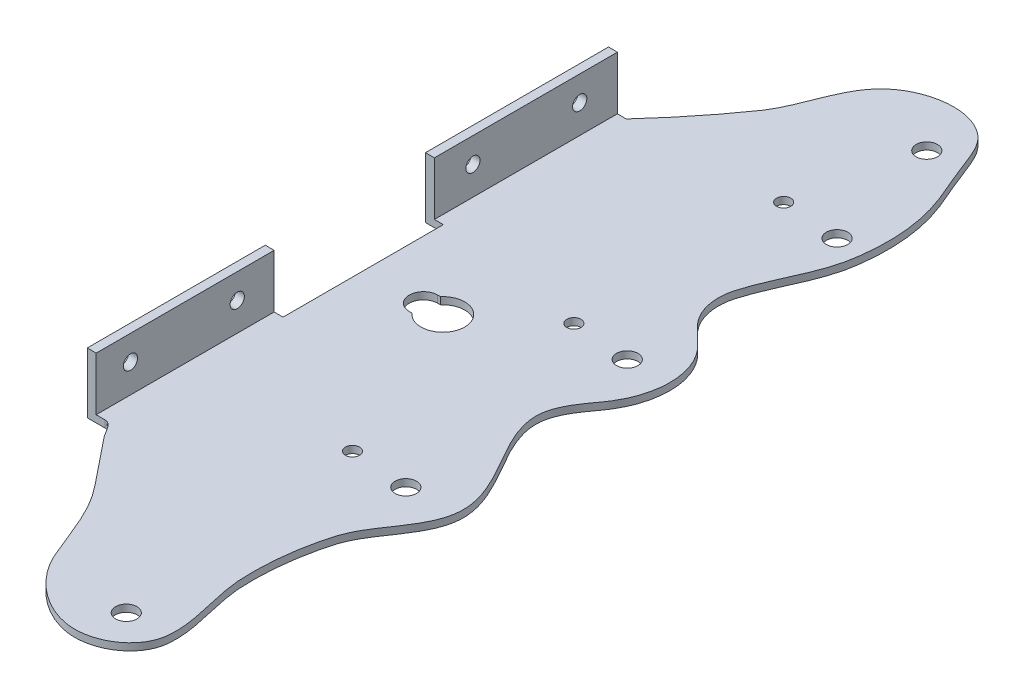
ISO-10303-21;
HEADER;
FILE_DESCRIPTION(('STEP AP214'),'2;1');
FILE_NAME('part.step','',(''),(''),'','','');
FILE_SCHEMA(('AUTOMOTIVE_DESIGN { 1 0 10303 214 1 1 1 1 }'));
ENDSEC;
DATA;
#1=APPLICATION_CONTEXT('core data for automotive mechanical design processes');
#2=APPLICATION_PROTOCOL_DEFINITION('international standard','automotive_design',2000,#1);
#3=PRODUCT_CONTEXT('',#1,'mechanical');
#4=PRODUCT('Part','Part','',(#3));
#5=PRODUCT_RELATED_PRODUCT_CATEGORY('part','',(#4));
#6=PRODUCT_DEFINITION_FORMATION('','',#4);
#7=PRODUCT_DEFINITION_CONTEXT('part definition',#1,'design');
#8=PRODUCT_DEFINITION('design','',#6,#7);
#9=PRODUCT_DEFINITION_SHAPE('','',#8);
#10=(LENGTH_UNIT() NAMED_UNIT(*) SI_UNIT(.MILLI.,.METRE.));
#11=(NAMED_UNIT(*) PLANE_ANGLE_UNIT() SI_UNIT($,.RADIAN.));
#12=(NAMED_UNIT(*) SI_UNIT($,.STERADIAN.) SOLID_ANGLE_UNIT());
#13=UNCERTAINTY_MEASURE_WITH_UNIT(LENGTH_MEASURE(1.E-05),#10,'distance_accuracy_value','');
#14=(GEOMETRIC_REPRESENTATION_CONTEXT(3) GLOBAL_UNCERTAINTY_ASSIGNED_CONTEXT((#13)) GLOBAL_UNIT_ASSIGNED_CONTEXT((#10,
#11,#12)) REPRESENTATION_CONTEXT('',''));
#15=CARTESIAN_POINT('',(0.,0.,0.));
#16=DIRECTION('',(0.,0.,1.));
#17=DIRECTION('',(1.,0.,0.));
#18=AXIS2_PLACEMENT_3D('',#15,#16,#17);
#19=CARTESIAN_POINT('',(255.661074439726,2.,1028.80563383513));
#20=DIRECTION('',(0.,-1.,0.));
#21=DIRECTION('',(0.,0.,1.));
#22=AXIS2_PLACEMENT_3D('',#19,#20,#21);
#23=PLANE('',#22);
#24=CARTESIAN_POINT('',(454.197507278282,2.,1130.7574095105));
#25=DIRECTION('',(0.,-1.,0.));
#26=DIRECTION('',(0.,0.,-1.));
#27=AXIS2_PLACEMENT_3D('',#24,#25,#26);
#28=CIRCLE('',#27,2.99999999999999);
#29=CARTESIAN_POINT('',(454.197507278282,2.,1127.7574095105));
#30=VERTEX_POINT('',#29);
#31=EDGE_CURVE('E437',#30,#30,#28,.T.);
#32=ORIENTED_EDGE('',*,*,#31,.T.);
#33=EDGE_LOOP('',(#32));
#34=FACE_BOUND('',#33,.T.);
#35=CARTESIAN_POINT('',(462.939861939,2.,1164.71408522884));
#36=DIRECTION('',(0.,-1.,0.));
#37=DIRECTION('',(0.,0.,-1.));
#38=AXIS2_PLACEMENT_3D('',#35,#36,#37);
#39=CIRCLE('',#38,2.99999999999999);
#40=CARTESIAN_POINT('',(462.939861939,2.,1161.71408522884));
#41=VERTEX_POINT('',#40);
#42=EDGE_CURVE('E433',#41,#41,#39,.T.);
#43=ORIENTED_EDGE('',*,*,#42,.T.);
#44=EDGE_LOOP('',(#43));
#45=FACE_BOUND('',#44,.T.);
#46=CARTESIAN_POINT('',(462.939861939,2.,1223.64910089011));
#47=DIRECTION('',(0.,-1.,0.));
#48=DIRECTION('',(0.,0.,-1.));
#49=AXIS2_PLACEMENT_3D('',#46,#47,#48);
#50=CIRCLE('',#49,2.99999999999999);
#51=CARTESIAN_POINT('',(462.939861939,2.,1220.64910089011));
#52=VERTEX_POINT('',#51);
#53=EDGE_CURVE('E431',#52,#52,#50,.T.);
#54=ORIENTED_EDGE('',*,*,#53,.T.);
#55=EDGE_LOOP('',(#54));
#56=FACE_BOUND('',#55,.T.);
#57=CARTESIAN_POINT('',(462.939861939,2.,1285.84435146029));
#58=DIRECTION('',(0.,-1.,0.));
#59=DIRECTION('',(0.,0.,-1.));
#60=AXIS2_PLACEMENT_3D('',#57,#58,#59);
#61=CIRCLE('',#60,2.99999999999999);
#62=CARTESIAN_POINT('',(462.939861939,2.,1282.84435146029));
#63=VERTEX_POINT('',#62);
#64=EDGE_CURVE('E434',#63,#63,#61,.T.);
#65=ORIENTED_EDGE('',*,*,#64,.T.);
#66=EDGE_LOOP('',(#65));
#67=FACE_BOUND('',#66,.T.);
#68=CARTESIAN_POINT('',(454.197507278282,2.,1355.62910089056));
#69=DIRECTION('',(0.,-1.,0.));
#70=DIRECTION('',(0.,0.,-1.));
#71=AXIS2_PLACEMENT_3D('',#68,#69,#70);
#72=CIRCLE('',#71,2.99999999999999);
#73=CARTESIAN_POINT('',(454.197507278282,2.,1352.62910089056));
#74=VERTEX_POINT('',#73);
#75=EDGE_CURVE('E440',#74,#74,#72,.T.);
#76=ORIENTED_EDGE('',*,*,#75,.T.);
#77=EDGE_LOOP('',(#76));
#78=FACE_BOUND('',#77,.T.);
#79=CARTESIAN_POINT('',(446.65971355284,2.,1222.36199710261));
#80=DIRECTION('',(0.,-1.,0.));
#81=DIRECTION('',(0.,0.,-1.));
#82=AXIS2_PLACEMENT_3D('',#79,#80,#81);
#83=CIRCLE('',#82,2.);
#84=CARTESIAN_POINT('',(446.65971355284,2.,1220.36199710261));
#85=VERTEX_POINT('',#84);
#86=EDGE_CURVE('E480',#85,#85,#83,.T.);
#87=ORIENTED_EDGE('',*,*,#86,.T.);
#88=EDGE_LOOP('',(#87));
#89=FACE_BOUND('',#88,.T.);
#90=CARTESIAN_POINT('',(446.65971355284,2.,1163.42698144134));
#91=DIRECTION('',(0.,-1.,0.));
#92=DIRECTION('',(0.,0.,-1.));
#93=AXIS2_PLACEMENT_3D('',#90,#91,#92);
#94=CIRCLE('',#93,2.);
#95=CARTESIAN_POINT('',(446.65971355284,2.,1161.42698144134));
#96=VERTEX_POINT('',#95);
#97=EDGE_CURVE('E185',#96,#96,#94,.T.);
#98=ORIENTED_EDGE('',*,*,#97,.T.);
#99=EDGE_LOOP('',(#98));
#100=FACE_BOUND('',#99,.T.);
#101=DIRECTION('',(-1.,0.,0.));
#102=VECTOR('',#101,1.);
#103=CARTESIAN_POINT('',(421.436838318646,2.,1242.58627070393));
#104=LINE('',#103,#102);
#105=CARTESIAN_POINT('',(421.436838318646,2.,1242.58627070393));
#106=VERTEX_POINT('',#105);
#107=CARTESIAN_POINT('',(420.648750920919,2.,1242.58627070393));
#108=VERTEX_POINT('',#107);
#109=EDGE_CURVE('E171',#106,#108,#104,.T.);
#110=ORIENTED_EDGE('',*,*,#109,.T.);
#111=CARTESIAN_POINT('',(420.648750920919,2.,1238.58627070393));
#112=DIRECTION('',(0.,-1.,0.));
#113=DIRECTION('',(0.,0.,-1.));
#114=AXIS2_PLACEMENT_3D('',#111,#112,#113);
#115=CIRCLE('',#114,4.);
#116=CARTESIAN_POINT('',(420.64875092092,2.,1234.58627070393));
#117=VERTEX_POINT('',#116);
#118=EDGE_CURVE('E187',#108,#117,#115,.T.);
#119=ORIENTED_EDGE('',*,*,#118,.T.);
#120=DIRECTION('',(1.,0.,0.));
#121=VECTOR('',#120,1.);
#122=CARTESIAN_POINT('',(420.648750920919,2.,1234.58627070393));
#123=LINE('',#122,#121);
#124=CARTESIAN_POINT('',(421.436838318646,2.,1234.58627070393));
#125=VERTEX_POINT('',#124);
#126=EDGE_CURVE('E198',#117,#125,#123,.T.);
#127=ORIENTED_EDGE('',*,*,#126,.T.);
#128=CARTESIAN_POINT('',(426.08968266473,2.,1238.58627070393));
#129=DIRECTION('',(0.,1.,0.));
#130=DIRECTION('',(0.,0.,1.));
#131=AXIS2_PLACEMENT_3D('',#128,#129,#130);
#132=CIRCLE('',#131,6.13587487721889);
#133=EDGE_CURVE('E184',#106,#125,#132,.T.);
#134=ORIENTED_EDGE('',*,*,#133,.F.);
#135=EDGE_LOOP('',(#110,#119,#127,#134));
#136=FACE_BOUND('',#135,.T.);
#137=DIRECTION('',(0.,0.,1.));
#138=VECTOR('',#137,1.);
#139=CARTESIAN_POINT('',(401.796086460194,2.,1216.68291310392));
#140=LINE('',#139,#138);
#141=CARTESIAN_POINT('',(401.796086460194,2.,1165.26432310716));
#142=VERTEX_POINT('',#141);
#143=CARTESIAN_POINT('',(401.796086460194,2.,1216.68291310392));
#144=VERTEX_POINT('',#143);
#145=EDGE_CURVE('E202',#142,#144,#140,.T.);
#146=ORIENTED_EDGE('',*,*,#145,.T.);
#147=DIRECTION('',(1.,0.,0.));
#148=VECTOR('',#147,1.);
#149=CARTESIAN_POINT('',(399.293679944663,2.,1216.68291310392));
#150=LINE('',#149,#148);
#151=CARTESIAN_POINT('',(404.298492975727,2.,1216.68291310392));
#152=VERTEX_POINT('',#151);
#153=EDGE_CURVE('E231',#144,#152,#150,.T.);
#154=ORIENTED_EDGE('',*,*,#153,.T.);
#155=DIRECTION('',(0.,0.,1.));
#156=VECTOR('',#155,1.);
#157=CARTESIAN_POINT('',(404.298492975727,2.,1165.26432310716));
#158=LINE('',#157,#156);
#159=CARTESIAN_POINT('',(404.298492975727,2.,1261.68291310392));
#160=VERTEX_POINT('',#159);
#161=EDGE_CURVE('E287',#152,#160,#158,.T.);
#162=ORIENTED_EDGE('',*,*,#161,.T.);
#163=DIRECTION('',(1.,0.,0.));
#164=VECTOR('',#163,1.);
#165=CARTESIAN_POINT('',(399.293679944663,2.,1261.68291310392));
#166=LINE('',#165,#164);
#167=CARTESIAN_POINT('',(401.796086460194,2.,1261.68291310392));
#168=VERTEX_POINT('',#167);
#169=EDGE_CURVE('E274',#168,#160,#166,.T.);
#170=ORIENTED_EDGE('',*,*,#169,.F.);
#171=DIRECTION('',(0.,0.,1.));
#172=VECTOR('',#171,1.);
#173=CARTESIAN_POINT('',(401.796086460194,2.,1311.68291310392));
#174=LINE('',#173,#172);
#175=CARTESIAN_POINT('',(401.796086460194,2.,1311.68291310392));
#176=VERTEX_POINT('',#175);
#177=EDGE_CURVE('E244',#168,#176,#174,.T.);
#178=ORIENTED_EDGE('',*,*,#177,.T.);
#179=DIRECTION('',(1.,0.,0.));
#180=VECTOR('',#179,1.);
#181=CARTESIAN_POINT('',(399.293679944663,2.,1311.68291310392));
#182=LINE('',#181,#180);
#183=CARTESIAN_POINT('',(404.298492975727,2.,1311.68291310392));
#184=VERTEX_POINT('',#183);
#185=EDGE_CURVE('E270',#176,#184,#182,.T.);
#186=ORIENTED_EDGE('',*,*,#185,.T.);
#187=CARTESIAN_POINT('',(404.298492975727,2.,1311.68291310392));
#188=CARTESIAN_POINT('',(406.295600934266,2.,1311.73670595974));
#189=CARTESIAN_POINT('',(407.085011737817,2.,1314.44879871172));
#190=CARTESIAN_POINT('',(409.575192944788,2.,1317.5434505828));
#191=CARTESIAN_POINT('',(410.820283548274,2.,1319.09077651834));
#192=CARTESIAN_POINT('',(414.555555358731,2.,1323.73275432495));
#193=CARTESIAN_POINT('',(417.064874752061,2.,1326.79999933437));
#194=CARTESIAN_POINT('',(424.513235646728,2.,1336.3101324201));
#195=CARTESIAN_POINT('',(426.853193629925,2.,1344.04509664726));
#196=CARTESIAN_POINT('',(433.171429491688,2.,1358.70777750479));
#197=CARTESIAN_POINT('',(440.246388319815,2.,1365.15509536691));
#198=CARTESIAN_POINT('',(456.088524035443,2.,1368.09341802965));
#199=CARTESIAN_POINT('',(464.999916661629,2.,1362.93260796018));
#200=CARTESIAN_POINT('',(466.165817384064,2.,1346.91506331004));
#201=CARTESIAN_POINT('',(462.473581677715,2.,1339.19033657056));
#202=CARTESIAN_POINT('',(461.762695776429,2.,1323.25818510204));
#203=CARTESIAN_POINT('',(462.721630003401,2.,1315.29199422972));
#204=CARTESIAN_POINT('',(467.160419551933,2.,1300.06745588101));
#205=CARTESIAN_POINT('',(474.17625309899,2.,1294.50552442475));
#206=CARTESIAN_POINT('',(477.954929379964,2.,1278.72367697068));
#207=CARTESIAN_POINT('',(472.734514964729,2.,1270.97658607166));
#208=CARTESIAN_POINT('',(465.105690644388,2.,1257.2724683784));
#209=CARTESIAN_POINT('',(463.326944585366,2.,1252.4305742544));
#210=CARTESIAN_POINT('',(464.721292468545,2.,1244.26561835925));
#211=CARTESIAN_POINT('',(467.324164939411,2.,1240.80520416999));
#212=CARTESIAN_POINT('',(474.859619179385,2.,1230.45901557285));
#213=CARTESIAN_POINT('',(476.348995327918,2.,1220.80819832412));
#214=CARTESIAN_POINT('',(469.715777811257,2.,1209.81143323898));
#215=CARTESIAN_POINT('',(465.878031568866,2.,1207.57126665351));
#216=CARTESIAN_POINT('',(460.805018265854,2.,1200.61149649099));
#217=CARTESIAN_POINT('',(460.133507775431,2.,1195.93397954467));
#218=CARTESIAN_POINT('',(463.620047448152,2.,1183.54943758628));
#219=CARTESIAN_POINT('',(468.654313929908,2.,1176.213189786));
#220=CARTESIAN_POINT('',(471.504835360422,2.,1159.35233282218));
#221=CARTESIAN_POINT('',(471.10454470028,2.,1150.51786853807));
#222=CARTESIAN_POINT('',(466.884735434399,2.,1138.41732568748));
#223=CARTESIAN_POINT('',(465.012012783357,2.,1134.57344816104));
#224=CARTESIAN_POINT('',(461.842122723715,2.,1126.61511106856));
#225=CARTESIAN_POINT('',(460.633411015589,2.,1122.17984978088));
#226=CARTESIAN_POINT('',(450.489854867589,2.,1114.24592382287));
#227=CARTESIAN_POINT('',(439.660076739881,2.,1115.94459527402));
#228=CARTESIAN_POINT('',(427.144129501304,2.,1127.18007234506));
#229=CARTESIAN_POINT('',(426.027987251622,2.,1136.67754395337));
#230=CARTESIAN_POINT('',(421.436838304636,2.,1143.83803006286));
#231=B_SPLINE_CURVE_WITH_KNOTS('',3,(#187,#188,#189,#190,#191,#192,#193,#194,#195,#196,#197,
#198,#199,#200,#201,#202,#203,#204,#205,#206,#207,#208,#209,#210,#211,#212,#213,#214,#215,#216,
#217,#218,#219,#220,#221,#222,#223,#224,#225,#226,#227,#228,#229,#230),.UNSPECIFIED.,.F.,.F.,(4,
2,2,2,2,2,2,2,2,2,2,2,2,2,2,2,2,2,2,2,2,4),(0.,0.0156249999999999,0.0312499999999998,
0.0625000000000006,0.125000000000001,0.187500000000001,0.250000000000002,0.312500000000002,
0.375000000000002,0.437500000000003,0.500000000000003,0.531250000000003,0.562500000000003,
0.625000000000004,0.656250000000003,0.687500000000003,0.750000000000001,0.8125,
0.843750000000001,0.875000000000001,0.9375,1.),.UNSPECIFIED.);
#232=CARTESIAN_POINT('',(421.436838304636,2.,1143.83803006286));
#233=VERTEX_POINT('',#232);
#234=EDGE_CURVE('E291',#184,#233,#231,.T.);
#235=ORIENTED_EDGE('',*,*,#234,.T.);
#236=CARTESIAN_POINT('',(255.661074439726,2.,1028.80563383513));
#237=DIRECTION('',(0.,-1.,0.));
#238=DIRECTION('',(0.,0.,1.));
#239=AXIS2_PLACEMENT_3D('',#236,#237,#238);
#240=CIRCLE('',#239,201.777243679479);
#241=CARTESIAN_POINT('',(404.298492975727,2.,1165.26432310716));
#242=VERTEX_POINT('',#241);
#243=EDGE_CURVE('E284',#233,#242,#240,.T.);
#244=ORIENTED_EDGE('',*,*,#243,.T.);
#245=DIRECTION('',(1.,0.,0.));
#246=VECTOR('',#245,1.);
#247=CARTESIAN_POINT('',(399.293679944663,2.,1165.26432310716));
#248=LINE('',#247,#246);
#249=EDGE_CURVE('E235',#142,#242,#248,.T.);
#250=ORIENTED_EDGE('',*,*,#249,.F.);
#251=EDGE_LOOP('',(#146,#154,#162,#170,#178,#186,#235,#244,#250));
#252=FACE_BOUND('',#251,.T.);
#253=CARTESIAN_POINT('',(446.65971355284,2.,1284.55724767279));
#254=DIRECTION('',(0.,-1.,0.));
#255=DIRECTION('',(0.,0.,-1.));
#256=AXIS2_PLACEMENT_3D('',#253,#254,#255);
#257=CIRCLE('',#256,2.);
#258=CARTESIAN_POINT('',(446.65971355284,2.,1282.55724767279));
#259=VERTEX_POINT('',#258);
#260=EDGE_CURVE('E190',#259,#259,#257,.T.);
#261=ORIENTED_EDGE('',*,*,#260,.T.);
#262=EDGE_LOOP('',(#261));
#263=FACE_BOUND('',#262,.T.);
#264=ADVANCED_FACE('F43',(#34,#45,#56,#67,#78,#89,#100,#136,#252,#263),#23,.F.);
#265=CARTESIAN_POINT('',(255.661074439726,0.,1028.80563383513));
#266=DIRECTION('',(0.,-1.,0.));
#267=DIRECTION('',(0.,0.,1.));
#268=AXIS2_PLACEMENT_3D('',#265,#266,#267);
#269=PLANE('',#268);
#270=CARTESIAN_POINT('',(446.65971355284,0.,1222.36199710261));
#271=DIRECTION('',(0.,1.,0.));
#272=DIRECTION('',(0.,0.,1.));
#273=AXIS2_PLACEMENT_3D('',#270,#271,#272);
#274=CIRCLE('',#273,2.);
#275=CARTESIAN_POINT('',(446.65971355284,0.,1224.36199710261));
#276=VERTEX_POINT('',#275);
#277=EDGE_CURVE('E445',#276,#276,#274,.T.);
#278=ORIENTED_EDGE('',*,*,#277,.T.);
#279=EDGE_LOOP('',(#278));
#280=FACE_BOUND('',#279,.T.);
#281=CARTESIAN_POINT('',(446.65971355284,0.,1163.42698144134));
#282=DIRECTION('',(0.,1.,0.));
#283=DIRECTION('',(0.,0.,1.));
#284=AXIS2_PLACEMENT_3D('',#281,#282,#283);
#285=CIRCLE('',#284,2.);
#286=CARTESIAN_POINT('',(446.65971355284,0.,1165.42698144134));
#287=VERTEX_POINT('',#286);
#288=EDGE_CURVE('E452',#287,#287,#285,.T.);
#289=ORIENTED_EDGE('',*,*,#288,.T.);
#290=EDGE_LOOP('',(#289));
#291=FACE_BOUND('',#290,.T.);
#292=CARTESIAN_POINT('',(454.197507278282,0.,1130.7574095105));
#293=DIRECTION('',(0.,1.,0.));
#294=DIRECTION('',(0.,0.,1.));
#295=AXIS2_PLACEMENT_3D('',#292,#293,#294);
#296=CIRCLE('',#295,2.99999999999999);
#297=CARTESIAN_POINT('',(454.197507278282,0.,1133.7574095105));
#298=VERTEX_POINT('',#297);
#299=EDGE_CURVE('E47',#298,#298,#296,.T.);
#300=ORIENTED_EDGE('',*,*,#299,.T.);
#301=EDGE_LOOP('',(#300));
#302=FACE_BOUND('',#301,.T.);
#303=CARTESIAN_POINT('',(462.939861939,0.,1164.71408522884));
#304=DIRECTION('',(0.,1.,0.));
#305=DIRECTION('',(0.,0.,1.));
#306=AXIS2_PLACEMENT_3D('',#303,#304,#305);
#307=CIRCLE('',#306,2.99999999999999);
#308=CARTESIAN_POINT('',(462.939861939,0.,1167.71408522884));
#309=VERTEX_POINT('',#308);
#310=EDGE_CURVE('E511',#309,#309,#307,.T.);
#311=ORIENTED_EDGE('',*,*,#310,.T.);
#312=EDGE_LOOP('',(#311));
#313=FACE_BOUND('',#312,.T.);
#314=CARTESIAN_POINT('',(462.939861939,0.,1223.64910089011));
#315=DIRECTION('',(0.,1.,0.));
#316=DIRECTION('',(0.,0.,1.));
#317=AXIS2_PLACEMENT_3D('',#314,#315,#316);
#318=CIRCLE('',#317,2.99999999999999);
#319=CARTESIAN_POINT('',(462.939861939,0.,1226.64910089011));
#320=VERTEX_POINT('',#319);
#321=EDGE_CURVE('E428',#320,#320,#318,.T.);
#322=ORIENTED_EDGE('',*,*,#321,.T.);
#323=EDGE_LOOP('',(#322));
#324=FACE_BOUND('',#323,.T.);
#325=CARTESIAN_POINT('',(462.939861939,0.,1285.84435146029));
#326=DIRECTION('',(0.,1.,0.));
#327=DIRECTION('',(0.,0.,1.));
#328=AXIS2_PLACEMENT_3D('',#325,#326,#327);
#329=CIRCLE('',#328,2.99999999999999);
#330=CARTESIAN_POINT('',(462.939861939,0.,1288.84435146029));
#331=VERTEX_POINT('',#330);
#332=EDGE_CURVE('E508',#331,#331,#329,.T.);
#333=ORIENTED_EDGE('',*,*,#332,.T.);
#334=EDGE_LOOP('',(#333));
#335=FACE_BOUND('',#334,.T.);
#336=CARTESIAN_POINT('',(454.197507278282,0.,1355.62910089056));
#337=DIRECTION('',(0.,1.,0.));
#338=DIRECTION('',(0.,0.,1.));
#339=AXIS2_PLACEMENT_3D('',#336,#337,#338);
#340=CIRCLE('',#339,2.99999999999999);
#341=CARTESIAN_POINT('',(454.197507278282,0.,1358.62910089056));
#342=VERTEX_POINT('',#341);
#343=EDGE_CURVE('E455',#342,#342,#340,.T.);
#344=ORIENTED_EDGE('',*,*,#343,.T.);
#345=EDGE_LOOP('',(#344));
#346=FACE_BOUND('',#345,.T.);
#347=CARTESIAN_POINT('',(446.65971355284,0.,1284.55724767279));
#348=DIRECTION('',(0.,1.,0.));
#349=DIRECTION('',(0.,0.,1.));
#350=AXIS2_PLACEMENT_3D('',#347,#348,#349);
#351=CIRCLE('',#350,2.);
#352=CARTESIAN_POINT('',(446.65971355284,0.,1286.55724767279));
#353=VERTEX_POINT('',#352);
#354=EDGE_CURVE('E449',#353,#353,#351,.T.);
#355=ORIENTED_EDGE('',*,*,#354,.T.);
#356=EDGE_LOOP('',(#355));
#357=FACE_BOUND('',#356,.T.);
#358=CARTESIAN_POINT('',(255.661074439726,0.,1028.80563383513));
#359=DIRECTION('',(0.,-1.,0.));
#360=DIRECTION('',(0.,0.,1.));
#361=AXIS2_PLACEMENT_3D('',#358,#359,#360);
#362=CIRCLE('',#361,201.777243679479);
#363=CARTESIAN_POINT('',(421.436838304636,0.,1143.83803006286));
#364=VERTEX_POINT('',#363);
#365=CARTESIAN_POINT('',(404.298492975727,0.,1165.26432310716));
#366=VERTEX_POINT('',#365);
#367=EDGE_CURVE('E283',#364,#366,#362,.T.);
#368=ORIENTED_EDGE('',*,*,#367,.F.);
#369=CARTESIAN_POINT('',(404.298492975727,0.,1311.68291310392));
#370=CARTESIAN_POINT('',(406.295600934266,0.,1311.73670595974));
#371=CARTESIAN_POINT('',(407.085011737817,0.,1314.44879871172));
#372=CARTESIAN_POINT('',(409.575192944788,0.,1317.5434505828));
#373=CARTESIAN_POINT('',(410.820283548274,0.,1319.09077651834));
#374=CARTESIAN_POINT('',(414.555555358731,0.,1323.73275432495));
#375=CARTESIAN_POINT('',(417.064874752061,0.,1326.79999933437));
#376=CARTESIAN_POINT('',(424.513235646728,0.,1336.3101324201));
#377=CARTESIAN_POINT('',(426.853193629925,0.,1344.04509664726));
#378=CARTESIAN_POINT('',(433.171429491688,0.,1358.70777750479));
#379=CARTESIAN_POINT('',(440.246388319815,0.,1365.15509536691));
#380=CARTESIAN_POINT('',(456.088524035443,0.,1368.09341802965));
#381=CARTESIAN_POINT('',(464.999916661629,0.,1362.93260796018));
#382=CARTESIAN_POINT('',(466.165817384064,0.,1346.91506331004));
#383=CARTESIAN_POINT('',(462.473581677715,0.,1339.19033657056));
#384=CARTESIAN_POINT('',(461.762695776429,0.,1323.25818510204));
#385=CARTESIAN_POINT('',(462.721630003401,0.,1315.29199422972));
#386=CARTESIAN_POINT('',(467.160419551933,0.,1300.06745588101));
#387=CARTESIAN_POINT('',(474.17625309899,0.,1294.50552442475));
#388=CARTESIAN_POINT('',(477.954929379964,0.,1278.72367697068));
#389=CARTESIAN_POINT('',(472.734514964729,0.,1270.97658607166));
#390=CARTESIAN_POINT('',(465.105690644388,0.,1257.2724683784));
#391=CARTESIAN_POINT('',(463.326944585366,0.,1252.4305742544));
#392=CARTESIAN_POINT('',(464.721292468545,0.,1244.26561835925));
#393=CARTESIAN_POINT('',(467.324164939411,0.,1240.80520416999));
#394=CARTESIAN_POINT('',(474.859619179385,0.,1230.45901557285));
#395=CARTESIAN_POINT('',(476.348995327918,0.,1220.80819832412));
#396=CARTESIAN_POINT('',(469.715777811257,0.,1209.81143323898));
#397=CARTESIAN_POINT('',(465.878031568866,0.,1207.57126665351));
#398=CARTESIAN_POINT('',(460.805018265854,0.,1200.61149649099));
#399=CARTESIAN_POINT('',(460.133507775431,0.,1195.93397954467));
#400=CARTESIAN_POINT('',(463.620047448152,0.,1183.54943758628));
#401=CARTESIAN_POINT('',(468.654313929908,0.,1176.213189786));
#402=CARTESIAN_POINT('',(471.504835360422,0.,1159.35233282218));
#403=CARTESIAN_POINT('',(471.10454470028,0.,1150.51786853807));
#404=CARTESIAN_POINT('',(466.884735434399,0.,1138.41732568748));
#405=CARTESIAN_POINT('',(465.012012783357,0.,1134.57344816104));
#406=CARTESIAN_POINT('',(461.842122723715,0.,1126.61511106856));
#407=CARTESIAN_POINT('',(460.633411015589,0.,1122.17984978088));
#408=CARTESIAN_POINT('',(450.489854867589,0.,1114.24592382287));
#409=CARTESIAN_POINT('',(439.660076739881,0.,1115.94459527402));
#410=CARTESIAN_POINT('',(427.144129501304,0.,1127.18007234506));
#411=CARTESIAN_POINT('',(426.027987251622,0.,1136.67754395337));
#412=CARTESIAN_POINT('',(421.436838304636,0.,1143.83803006286));
#413=B_SPLINE_CURVE_WITH_KNOTS('',3,(#369,#370,#371,#372,#373,#374,#375,#376,#377,#378,#379,
#380,#381,#382,#383,#384,#385,#386,#387,#388,#389,#390,#391,#392,#393,#394,#395,#396,#397,#398,
#399,#400,#401,#402,#403,#404,#405,#406,#407,#408,#409,#410,#411,#412),.UNSPECIFIED.,.F.,.F.,(4,
2,2,2,2,2,2,2,2,2,2,2,2,2,2,2,2,2,2,2,2,4),(0.,0.0156249999999999,0.0312499999999998,
0.0625000000000006,0.125000000000001,0.187500000000001,0.250000000000002,0.312500000000002,
0.375000000000002,0.437500000000003,0.500000000000003,0.531250000000003,0.562500000000003,
0.625000000000004,0.656250000000003,0.687500000000003,0.750000000000001,0.8125,
0.843750000000001,0.875000000000001,0.9375,1.),.UNSPECIFIED.);
#414=CARTESIAN_POINT('',(404.298492975727,0.,1311.68291310392));
#415=VERTEX_POINT('',#414);
#416=EDGE_CURVE('E288',#415,#364,#413,.T.);
#417=ORIENTED_EDGE('',*,*,#416,.F.);
#418=DIRECTION('',(1.,0.,0.));
#419=VECTOR('',#418,1.);
#420=CARTESIAN_POINT('',(399.293679944663,0.,1311.68291310392));
#421=LINE('',#420,#419);
#422=CARTESIAN_POINT('',(399.293679944663,0.,1311.68291310392));
#423=VERTEX_POINT('',#422);
#424=EDGE_CURVE('E280',#423,#415,#421,.T.);
#425=ORIENTED_EDGE('',*,*,#424,.F.);
#426=DIRECTION('',(0.,0.,-1.));
#427=VECTOR('',#426,1.);
#428=CARTESIAN_POINT('',(399.293679944663,0.,1261.68291310392));
#429=LINE('',#428,#427);
#430=CARTESIAN_POINT('',(399.293679944663,0.,1261.68291310392));
#431=VERTEX_POINT('',#430);
#432=EDGE_CURVE('E264',#423,#431,#429,.T.);
#433=ORIENTED_EDGE('',*,*,#432,.T.);
#434=DIRECTION('',(1.,0.,0.));
#435=VECTOR('',#434,1.);
#436=CARTESIAN_POINT('',(399.293679944663,0.,1261.68291310392));
#437=LINE('',#436,#435);
#438=CARTESIAN_POINT('',(404.298492975727,0.,1261.68291310392));
#439=VERTEX_POINT('',#438);
#440=EDGE_CURVE('E277',#431,#439,#437,.T.);
#441=ORIENTED_EDGE('',*,*,#440,.T.);
#442=DIRECTION('',(0.,0.,1.));
#443=VECTOR('',#442,1.);
#444=CARTESIAN_POINT('',(404.298492975727,0.,1165.26432310716));
#445=LINE('',#444,#443);
#446=CARTESIAN_POINT('',(404.298492975727,0.,1216.68291310392));
#447=VERTEX_POINT('',#446);
#448=EDGE_CURVE('E495',#447,#439,#445,.T.);
#449=ORIENTED_EDGE('',*,*,#448,.F.);
#450=DIRECTION('',(1.,0.,0.));
#451=VECTOR('',#450,1.);
#452=CARTESIAN_POINT('',(399.293679944663,0.,1216.68291310392));
#453=LINE('',#452,#451);
#454=CARTESIAN_POINT('',(399.293679944663,0.,1216.68291310392));
#455=VERTEX_POINT('',#454);
#456=EDGE_CURVE('E241',#455,#447,#453,.T.);
#457=ORIENTED_EDGE('',*,*,#456,.F.);
#458=DIRECTION('',(0.,0.,-1.));
#459=VECTOR('',#458,1.);
#460=CARTESIAN_POINT('',(399.293679944663,0.,1165.26432310716));
#461=LINE('',#460,#459);
#462=CARTESIAN_POINT('',(399.293679944663,0.,1165.26432310716));
#463=VERTEX_POINT('',#462);
#464=EDGE_CURVE('E225',#455,#463,#461,.T.);
#465=ORIENTED_EDGE('',*,*,#464,.T.);
#466=DIRECTION('',(1.,0.,0.));
#467=VECTOR('',#466,1.);
#468=CARTESIAN_POINT('',(399.293679944663,0.,1165.26432310716));
#469=LINE('',#468,#467);
#470=EDGE_CURVE('E238',#463,#366,#469,.T.);
#471=ORIENTED_EDGE('',*,*,#470,.T.);
#472=EDGE_LOOP('',(#368,#417,#425,#433,#441,#449,#457,#465,#471));
#473=FACE_BOUND('',#472,.T.);
#474=CARTESIAN_POINT('',(426.08968266473,0.,1238.58627070393));
#475=DIRECTION('',(0.,1.,0.));
#476=DIRECTION('',(0.,0.,1.));
#477=AXIS2_PLACEMENT_3D('',#474,#475,#476);
#478=CIRCLE('',#477,6.13587487721889);
#479=CARTESIAN_POINT('',(421.436838318646,0.,1242.58627070393));
#480=VERTEX_POINT('',#479);
#481=CARTESIAN_POINT('',(421.436838318646,0.,1234.58627070393));
#482=VERTEX_POINT('',#481);
#483=EDGE_CURVE('E179',#480,#482,#478,.T.);
#484=ORIENTED_EDGE('',*,*,#483,.T.);
#485=DIRECTION('',(1.,0.,0.));
#486=VECTOR('',#485,1.);
#487=CARTESIAN_POINT('',(420.648750920919,0.,1234.58627070393));
#488=LINE('',#487,#486);
#489=CARTESIAN_POINT('',(420.648750920919,0.,1234.58627070393));
#490=VERTEX_POINT('',#489);
#491=EDGE_CURVE('E181',#490,#482,#488,.T.);
#492=ORIENTED_EDGE('',*,*,#491,.F.);
#493=CARTESIAN_POINT('',(420.648750920919,0.,1238.58627070393));
#494=DIRECTION('',(0.,-1.,0.));
#495=DIRECTION('',(0.,0.,-1.));
#496=AXIS2_PLACEMENT_3D('',#493,#494,#495);
#497=CIRCLE('',#496,4.);
#498=CARTESIAN_POINT('',(420.648750920919,0.,1242.58627070393));
#499=VERTEX_POINT('',#498);
#500=EDGE_CURVE('E180',#499,#490,#497,.T.);
#501=ORIENTED_EDGE('',*,*,#500,.F.);
#502=DIRECTION('',(-1.,0.,0.));
#503=VECTOR('',#502,1.);
#504=CARTESIAN_POINT('',(421.436838318646,0.,1242.58627070393));
#505=LINE('',#504,#503);
#506=EDGE_CURVE('E168',#480,#499,#505,.T.);
#507=ORIENTED_EDGE('',*,*,#506,.F.);
#508=EDGE_LOOP('',(#484,#492,#501,#507));
#509=FACE_BOUND('',#508,.T.);
#510=ADVANCED_FACE('F177',(#280,#291,#302,#313,#324,#335,#346,#357,#473,#509),#269,.T.);
#511=CARTESIAN_POINT('',(404.298492975727,2.,1165.26432310716));
#512=DIRECTION('',(-1.,0.,0.));
#513=DIRECTION('',(0.,0.,-1.));
#514=AXIS2_PLACEMENT_3D('',#511,#512,#513);
#515=PLANE('',#514);
#516=ORIENTED_EDGE('',*,*,#448,.T.);
#517=DIRECTION('',(0.,1.,0.));
#518=VECTOR('',#517,1.);
#519=CARTESIAN_POINT('',(404.298492975727,2.,1261.68291310392));
#520=LINE('',#519,#518);
#521=EDGE_CURVE('E261',#439,#160,#520,.T.);
#522=ORIENTED_EDGE('',*,*,#521,.T.);
#523=ORIENTED_EDGE('',*,*,#161,.F.);
#524=DIRECTION('',(0.,-1.,0.));
#525=VECTOR('',#524,1.);
#526=CARTESIAN_POINT('',(404.298492975727,0.,1216.68291310392));
#527=LINE('',#526,#525);
#528=EDGE_CURVE('E222',#152,#447,#527,.T.);
#529=ORIENTED_EDGE('',*,*,#528,.T.);
#530=EDGE_LOOP('',(#516,#522,#523,#529));
#531=FACE_BOUND('',#530,.T.);
#532=ADVANCED_FACE('F309',(#531),#515,.T.);
#533=CARTESIAN_POINT('',(255.661074439726,2.,1028.80563383513));
#534=DIRECTION('',(0.,-1.,0.));
#535=DIRECTION('',(0.,0.,1.));
#536=AXIS2_PLACEMENT_3D('',#533,#534,#535);
#537=CYLINDRICAL_SURFACE('',#536,201.777243679479);
#538=ORIENTED_EDGE('',*,*,#367,.T.);
#539=DIRECTION('',(0.,-1.,0.));
#540=VECTOR('',#539,1.);
#541=CARTESIAN_POINT('',(404.298492975727,2.,1165.26432310716));
#542=LINE('',#541,#540);
#543=EDGE_CURVE('E297',#242,#366,#542,.T.);
#544=ORIENTED_EDGE('',*,*,#543,.F.);
#545=ORIENTED_EDGE('',*,*,#243,.F.);
#546=DIRECTION('',(0.,-1.,0.));
#547=VECTOR('',#546,1.);
#548=CARTESIAN_POINT('',(421.436838304636,2.,1143.83803006286));
#549=LINE('',#548,#547);
#550=EDGE_CURVE('E11',#233,#364,#549,.T.);
#551=ORIENTED_EDGE('',*,*,#550,.T.);
#552=EDGE_LOOP('',(#538,#544,#545,#551));
#553=FACE_BOUND('',#552,.T.);
#554=ADVANCED_FACE('F45',(#553),#537,.F.);
#555=DIRECTION('',(0.,-1.,0.));
#556=VECTOR('',#555,1.);
#557=SURFACE_OF_LINEAR_EXTRUSION('',#231,#556);
#558=ORIENTED_EDGE('',*,*,#416,.T.);
#559=ORIENTED_EDGE('',*,*,#550,.F.);
#560=ORIENTED_EDGE('',*,*,#234,.F.);
#561=DIRECTION('',(0.,-1.,0.));
#562=VECTOR('',#561,1.);
#563=CARTESIAN_POINT('',(404.298492975727,2.,1311.68291310392));
#564=LINE('',#563,#562);
#565=EDGE_CURVE('E52',#184,#415,#564,.T.);
#566=ORIENTED_EDGE('',*,*,#565,.T.);
#567=EDGE_LOOP('',(#558,#559,#560,#566));
#568=FACE_BOUND('',#567,.T.);
#569=ADVANCED_FACE('F303',(#568),#557,.F.);
#570=CARTESIAN_POINT('',(399.293679944663,0.,1311.68291310392));
#571=DIRECTION('',(0.,0.,-1.));
#572=DIRECTION('',(1.,0.,0.));
#573=AXIS2_PLACEMENT_3D('',#570,#571,#572);
#574=PLANE('',#573);
#575=ORIENTED_EDGE('',*,*,#565,.F.);
#576=ORIENTED_EDGE('',*,*,#185,.F.);
#577=DIRECTION('',(0.,-1.,0.));
#578=VECTOR('',#577,1.);
#579=CARTESIAN_POINT('',(401.796086460194,17.,1311.68291310392));
#580=LINE('',#579,#578);
#581=CARTESIAN_POINT('',(401.796086460194,17.,1311.68291310392));
#582=VERTEX_POINT('',#581);
#583=EDGE_CURVE('E255',#582,#176,#580,.T.);
#584=ORIENTED_EDGE('',*,*,#583,.F.);
#585=DIRECTION('',(-1.,0.,0.));
#586=VECTOR('',#585,1.);
#587=CARTESIAN_POINT('',(399.293679944663,17.,1311.68291310392));
#588=LINE('',#587,#586);
#589=CARTESIAN_POINT('',(399.293679944663,17.,1311.68291310392));
#590=VERTEX_POINT('',#589);
#591=EDGE_CURVE('E250',#582,#590,#588,.T.);
#592=ORIENTED_EDGE('',*,*,#591,.T.);
#593=DIRECTION('',(0.,-1.,0.));
#594=VECTOR('',#593,1.);
#595=CARTESIAN_POINT('',(399.293679944663,0.,1311.68291310392));
#596=LINE('',#595,#594);
#597=EDGE_CURVE('E262',#590,#423,#596,.T.);
#598=ORIENTED_EDGE('',*,*,#597,.T.);
#599=ORIENTED_EDGE('',*,*,#424,.T.);
#600=EDGE_LOOP('',(#575,#576,#584,#592,#598,#599));
#601=FACE_BOUND('',#600,.T.);
#602=ADVANCED_FACE('F306',(#601),#574,.F.);
#603=CARTESIAN_POINT('',(399.293679944663,2.,1261.68291310392));
#604=DIRECTION('',(0.,0.,1.));
#605=DIRECTION('',(-1.,0.,0.));
#606=AXIS2_PLACEMENT_3D('',#603,#604,#605);
#607=PLANE('',#606);
#608=ORIENTED_EDGE('',*,*,#521,.F.);
#609=ORIENTED_EDGE('',*,*,#440,.F.);
#610=DIRECTION('',(0.,1.,0.));
#611=VECTOR('',#610,1.);
#612=CARTESIAN_POINT('',(399.293679944663,2.,1261.68291310392));
#613=LINE('',#612,#611);
#614=CARTESIAN_POINT('',(399.293679944663,17.,1261.68291310392));
#615=VERTEX_POINT('',#614);
#616=EDGE_CURVE('E267',#431,#615,#613,.T.);
#617=ORIENTED_EDGE('',*,*,#616,.T.);
#618=DIRECTION('',(1.,0.,0.));
#619=VECTOR('',#618,1.);
#620=CARTESIAN_POINT('',(401.796086460194,17.,1261.68291310392));
#621=LINE('',#620,#619);
#622=CARTESIAN_POINT('',(401.796086460194,17.,1261.68291310392));
#623=VERTEX_POINT('',#622);
#624=EDGE_CURVE('E245',#615,#623,#621,.T.);
#625=ORIENTED_EDGE('',*,*,#624,.T.);
#626=DIRECTION('',(0.,-1.,0.));
#627=VECTOR('',#626,1.);
#628=CARTESIAN_POINT('',(401.796086460194,17.,1261.68291310392));
#629=LINE('',#628,#627);
#630=EDGE_CURVE('E259',#623,#168,#629,.T.);
#631=ORIENTED_EDGE('',*,*,#630,.T.);
#632=ORIENTED_EDGE('',*,*,#169,.T.);
#633=EDGE_LOOP('',(#608,#609,#617,#625,#631,#632));
#634=FACE_BOUND('',#633,.T.);
#635=ADVANCED_FACE('F328',(#634),#607,.F.);
#636=CARTESIAN_POINT('',(399.293679944663,0.,0.));
#637=DIRECTION('',(1.,0.,0.));
#638=DIRECTION('',(0.,0.,1.));
#639=AXIS2_PLACEMENT_3D('',#636,#637,#638);
#640=PLANE('',#639);
#641=CARTESIAN_POINT('',(399.293679944663,10.,1272.05583404728));
#642=DIRECTION('',(-1.,0.,0.));
#643=DIRECTION('',(0.,0.,1.));
#644=AXIS2_PLACEMENT_3D('',#641,#642,#643);
#645=CIRCLE('',#644,1.99999999999999);
#646=CARTESIAN_POINT('',(399.293679944663,10.,1274.05583404728));
#647=VERTEX_POINT('',#646);
#648=EDGE_CURVE('E459',#647,#647,#645,.T.);
#649=ORIENTED_EDGE('',*,*,#648,.F.);
#650=EDGE_LOOP('',(#649));
#651=FACE_BOUND('',#650,.T.);
#652=CARTESIAN_POINT('',(399.293679944663,10.,1302.05583404728));
#653=DIRECTION('',(-1.,0.,0.));
#654=DIRECTION('',(0.,0.,1.));
#655=AXIS2_PLACEMENT_3D('',#652,#653,#654);
#656=CIRCLE('',#655,1.99999999999999);
#657=CARTESIAN_POINT('',(399.293679944663,10.,1304.05583404728));
#658=VERTEX_POINT('',#657);
#659=EDGE_CURVE('E465',#658,#658,#656,.T.);
#660=ORIENTED_EDGE('',*,*,#659,.F.);
#661=EDGE_LOOP('',(#660));
#662=FACE_BOUND('',#661,.T.);
#663=ORIENTED_EDGE('',*,*,#597,.F.);
#664=DIRECTION('',(0.,0.,-1.));
#665=VECTOR('',#664,1.);
#666=CARTESIAN_POINT('',(399.293679944663,17.,1261.68291310392));
#667=LINE('',#666,#665);
#668=EDGE_CURVE('E253',#590,#615,#667,.T.);
#669=ORIENTED_EDGE('',*,*,#668,.T.);
#670=ORIENTED_EDGE('',*,*,#616,.F.);
#671=ORIENTED_EDGE('',*,*,#432,.F.);
#672=EDGE_LOOP('',(#663,#669,#670,#671));
#673=FACE_BOUND('',#672,.T.);
#674=ADVANCED_FACE('F332',(#651,#662,#673),#640,.F.);
#675=CARTESIAN_POINT('',(401.796086460194,17.,1311.68291310392));
#676=DIRECTION('',(-1.,0.,0.));
#677=DIRECTION('',(0.,0.,-1.));
#678=AXIS2_PLACEMENT_3D('',#675,#676,#677);
#679=PLANE('',#678);
#680=CARTESIAN_POINT('',(401.796086460194,10.,1272.05583404728));
#681=DIRECTION('',(-1.,0.,0.));
#682=DIRECTION('',(0.,0.,1.));
#683=AXIS2_PLACEMENT_3D('',#680,#681,#682);
#684=CIRCLE('',#683,1.99999999999999);
#685=CARTESIAN_POINT('',(401.796086460194,10.,1274.05583404728));
#686=VERTEX_POINT('',#685);
#687=EDGE_CURVE('E456',#686,#686,#684,.T.);
#688=ORIENTED_EDGE('',*,*,#687,.T.);
#689=EDGE_LOOP('',(#688));
#690=FACE_BOUND('',#689,.T.);
#691=CARTESIAN_POINT('',(401.796086460194,10.,1302.05583404728));
#692=DIRECTION('',(-1.,0.,0.));
#693=DIRECTION('',(0.,0.,1.));
#694=AXIS2_PLACEMENT_3D('',#691,#692,#693);
#695=CIRCLE('',#694,1.99999999999999);
#696=CARTESIAN_POINT('',(401.796086460194,10.,1304.05583404728));
#697=VERTEX_POINT('',#696);
#698=EDGE_CURVE('E462',#697,#697,#695,.T.);
#699=ORIENTED_EDGE('',*,*,#698,.T.);
#700=EDGE_LOOP('',(#699));
#701=FACE_BOUND('',#700,.T.);
#702=ORIENTED_EDGE('',*,*,#177,.F.);
#703=ORIENTED_EDGE('',*,*,#630,.F.);
#704=DIRECTION('',(0.,0.,1.));
#705=VECTOR('',#704,1.);
#706=CARTESIAN_POINT('',(401.796086460194,17.,1311.68291310392));
#707=LINE('',#706,#705);
#708=EDGE_CURVE('E248',#623,#582,#707,.T.);
#709=ORIENTED_EDGE('',*,*,#708,.T.);
#710=ORIENTED_EDGE('',*,*,#583,.T.);
#711=EDGE_LOOP('',(#702,#703,#709,#710));
#712=FACE_BOUND('',#711,.T.);
#713=ADVANCED_FACE('F336',(#690,#701,#712),#679,.F.);
#714=CARTESIAN_POINT('',(0.,17.,0.));
#715=DIRECTION('',(0.,-1.,0.));
#716=DIRECTION('',(0.,0.,1.));
#717=AXIS2_PLACEMENT_3D('',#714,#715,#716);
#718=PLANE('',#717);
#719=ORIENTED_EDGE('',*,*,#624,.F.);
#720=ORIENTED_EDGE('',*,*,#668,.F.);
#721=ORIENTED_EDGE('',*,*,#591,.F.);
#722=ORIENTED_EDGE('',*,*,#708,.F.);
#723=EDGE_LOOP('',(#719,#720,#721,#722));
#724=FACE_BOUND('',#723,.T.);
#725=ADVANCED_FACE('F340',(#724),#718,.F.);
#726=CARTESIAN_POINT('',(399.293679944663,0.,1216.68291310392));
#727=DIRECTION('',(0.,0.,-1.));
#728=DIRECTION('',(1.,0.,0.));
#729=AXIS2_PLACEMENT_3D('',#726,#727,#728);
#730=PLANE('',#729);
#731=ORIENTED_EDGE('',*,*,#528,.F.);
#732=ORIENTED_EDGE('',*,*,#153,.F.);
#733=DIRECTION('',(0.,-1.,0.));
#734=VECTOR('',#733,1.);
#735=CARTESIAN_POINT('',(401.796086460194,17.,1216.68291310392));
#736=LINE('',#735,#734);
#737=CARTESIAN_POINT('',(401.796086460194,17.,1216.68291310392));
#738=VERTEX_POINT('',#737);
#739=EDGE_CURVE('E220',#738,#144,#736,.T.);
#740=ORIENTED_EDGE('',*,*,#739,.F.);
#741=DIRECTION('',(-1.,0.,0.));
#742=VECTOR('',#741,1.);
#743=CARTESIAN_POINT('',(399.293679944663,17.,1216.68291310392));
#744=LINE('',#743,#742);
#745=CARTESIAN_POINT('',(399.293679944663,17.,1216.68291310392));
#746=VERTEX_POINT('',#745);
#747=EDGE_CURVE('E208',#738,#746,#744,.T.);
#748=ORIENTED_EDGE('',*,*,#747,.T.);
#749=DIRECTION('',(0.,-1.,0.));
#750=VECTOR('',#749,1.);
#751=CARTESIAN_POINT('',(399.293679944663,0.,1216.68291310392));
#752=LINE('',#751,#750);
#753=EDGE_CURVE('E223',#746,#455,#752,.T.);
#754=ORIENTED_EDGE('',*,*,#753,.T.);
#755=ORIENTED_EDGE('',*,*,#456,.T.);
#756=EDGE_LOOP('',(#731,#732,#740,#748,#754,#755));
#757=FACE_BOUND('',#756,.T.);
#758=ADVANCED_FACE('F344',(#757),#730,.F.);
#759=CARTESIAN_POINT('',(399.293679944663,2.,1165.26432310716));
#760=DIRECTION('',(0.,0.,1.));
#761=DIRECTION('',(-1.,0.,0.));
#762=AXIS2_PLACEMENT_3D('',#759,#760,#761);
#763=PLANE('',#762);
#764=ORIENTED_EDGE('',*,*,#543,.T.);
#765=ORIENTED_EDGE('',*,*,#470,.F.);
#766=DIRECTION('',(0.,1.,0.));
#767=VECTOR('',#766,1.);
#768=CARTESIAN_POINT('',(399.293679944663,2.,1165.26432310716));
#769=LINE('',#768,#767);
#770=CARTESIAN_POINT('',(399.293679944663,17.,1165.26432310716));
#771=VERTEX_POINT('',#770);
#772=EDGE_CURVE('E228',#463,#771,#769,.T.);
#773=ORIENTED_EDGE('',*,*,#772,.T.);
#774=DIRECTION('',(1.,0.,0.));
#775=VECTOR('',#774,1.);
#776=CARTESIAN_POINT('',(401.796086460194,17.,1165.26432310716));
#777=LINE('',#776,#775);
#778=CARTESIAN_POINT('',(401.796086460194,17.,1165.26432310716));
#779=VERTEX_POINT('',#778);
#780=EDGE_CURVE('E213',#771,#779,#777,.T.);
#781=ORIENTED_EDGE('',*,*,#780,.T.);
#782=DIRECTION('',(0.,-1.,0.));
#783=VECTOR('',#782,1.);
#784=CARTESIAN_POINT('',(401.796086460194,17.,1165.26432310716));
#785=LINE('',#784,#783);
#786=EDGE_CURVE('E216',#779,#142,#785,.T.);
#787=ORIENTED_EDGE('',*,*,#786,.T.);
#788=ORIENTED_EDGE('',*,*,#249,.T.);
#789=EDGE_LOOP('',(#764,#765,#773,#781,#787,#788));
#790=FACE_BOUND('',#789,.T.);
#791=ADVANCED_FACE('F348',(#790),#763,.F.);
#792=CARTESIAN_POINT('',(399.293679944663,0.,0.));
#793=DIRECTION('',(1.,0.,0.));
#794=DIRECTION('',(0.,0.,1.));
#795=AXIS2_PLACEMENT_3D('',#792,#793,#794);
#796=PLANE('',#795);
#797=CARTESIAN_POINT('',(399.293679944663,10.,1175.85583404728));
#798=DIRECTION('',(-1.,0.,0.));
#799=DIRECTION('',(0.,0.,1.));
#800=AXIS2_PLACEMENT_3D('',#797,#798,#799);
#801=CIRCLE('',#800,1.99999999999999);
#802=CARTESIAN_POINT('',(399.293679944663,10.,1177.85583404728));
#803=VERTEX_POINT('',#802);
#804=EDGE_CURVE('E471',#803,#803,#801,.T.);
#805=ORIENTED_EDGE('',*,*,#804,.F.);
#806=EDGE_LOOP('',(#805));
#807=FACE_BOUND('',#806,.T.);
#808=CARTESIAN_POINT('',(399.293679944663,10.,1205.85583404728));
#809=DIRECTION('',(-1.,0.,0.));
#810=DIRECTION('',(0.,0.,1.));
#811=AXIS2_PLACEMENT_3D('',#808,#809,#810);
#812=CIRCLE('',#811,1.99999999999999);
#813=CARTESIAN_POINT('',(399.293679944663,10.,1207.85583404728));
#814=VERTEX_POINT('',#813);
#815=EDGE_CURVE('E477',#814,#814,#812,.T.);
#816=ORIENTED_EDGE('',*,*,#815,.F.);
#817=EDGE_LOOP('',(#816));
#818=FACE_BOUND('',#817,.T.);
#819=ORIENTED_EDGE('',*,*,#753,.F.);
#820=DIRECTION('',(0.,0.,-1.));
#821=VECTOR('',#820,1.);
#822=CARTESIAN_POINT('',(399.293679944663,17.,1165.26432310716));
#823=LINE('',#822,#821);
#824=EDGE_CURVE('E211',#746,#771,#823,.T.);
#825=ORIENTED_EDGE('',*,*,#824,.T.);
#826=ORIENTED_EDGE('',*,*,#772,.F.);
#827=ORIENTED_EDGE('',*,*,#464,.F.);
#828=EDGE_LOOP('',(#819,#825,#826,#827));
#829=FACE_BOUND('',#828,.T.);
#830=ADVANCED_FACE('F352',(#807,#818,#829),#796,.F.);
#831=CARTESIAN_POINT('',(401.796086460194,17.,1216.68291310392));
#832=DIRECTION('',(-1.,0.,0.));
#833=DIRECTION('',(0.,0.,-1.));
#834=AXIS2_PLACEMENT_3D('',#831,#832,#833);
#835=PLANE('',#834);
#836=CARTESIAN_POINT('',(401.796086460194,10.,1175.85583404728));
#837=DIRECTION('',(-1.,0.,0.));
#838=DIRECTION('',(0.,0.,1.));
#839=AXIS2_PLACEMENT_3D('',#836,#837,#838);
#840=CIRCLE('',#839,1.99999999999999);
#841=CARTESIAN_POINT('',(401.796086460194,10.,1177.85583404728));
#842=VERTEX_POINT('',#841);
#843=EDGE_CURVE('E468',#842,#842,#840,.T.);
#844=ORIENTED_EDGE('',*,*,#843,.T.);
#845=EDGE_LOOP('',(#844));
#846=FACE_BOUND('',#845,.T.);
#847=CARTESIAN_POINT('',(401.796086460194,10.,1205.85583404728));
#848=DIRECTION('',(-1.,0.,0.));
#849=DIRECTION('',(0.,0.,1.));
#850=AXIS2_PLACEMENT_3D('',#847,#848,#849);
#851=CIRCLE('',#850,1.99999999999999);
#852=CARTESIAN_POINT('',(401.796086460194,10.,1207.85583404728));
#853=VERTEX_POINT('',#852);
#854=EDGE_CURVE('E474',#853,#853,#851,.T.);
#855=ORIENTED_EDGE('',*,*,#854,.T.);
#856=EDGE_LOOP('',(#855));
#857=FACE_BOUND('',#856,.T.);
#858=ORIENTED_EDGE('',*,*,#145,.F.);
#859=ORIENTED_EDGE('',*,*,#786,.F.);
#860=DIRECTION('',(0.,0.,1.));
#861=VECTOR('',#860,1.);
#862=CARTESIAN_POINT('',(401.796086460194,17.,1216.68291310392));
#863=LINE('',#862,#861);
#864=EDGE_CURVE('E206',#779,#738,#863,.T.);
#865=ORIENTED_EDGE('',*,*,#864,.T.);
#866=ORIENTED_EDGE('',*,*,#739,.T.);
#867=EDGE_LOOP('',(#858,#859,#865,#866));
#868=FACE_BOUND('',#867,.T.);
#869=ADVANCED_FACE('F356',(#846,#857,#868),#835,.F.);
#870=CARTESIAN_POINT('',(0.,17.,0.));
#871=DIRECTION('',(0.,-1.,0.));
#872=DIRECTION('',(0.,0.,1.));
#873=AXIS2_PLACEMENT_3D('',#870,#871,#872);
#874=PLANE('',#873);
#875=ORIENTED_EDGE('',*,*,#864,.F.);
#876=ORIENTED_EDGE('',*,*,#780,.F.);
#877=ORIENTED_EDGE('',*,*,#824,.F.);
#878=ORIENTED_EDGE('',*,*,#747,.F.);
#879=EDGE_LOOP('',(#875,#876,#877,#878));
#880=FACE_BOUND('',#879,.T.);
#881=ADVANCED_FACE('F360',(#880),#874,.F.);
#882=CARTESIAN_POINT('',(420.648750920919,0.,1238.58627070393));
#883=DIRECTION('',(0.,1.,0.));
#884=DIRECTION('',(0.,0.,-1.));
#885=AXIS2_PLACEMENT_3D('',#882,#883,#884);
#886=CYLINDRICAL_SURFACE('',#885,4.);
#887=ORIENTED_EDGE('',*,*,#118,.F.);
#888=DIRECTION('',(0.,1.,0.));
#889=VECTOR('',#888,1.);
#890=CARTESIAN_POINT('',(420.648750920919,0.,1242.58627070393));
#891=LINE('',#890,#889);
#892=EDGE_CURVE('E173',#499,#108,#891,.T.);
#893=ORIENTED_EDGE('',*,*,#892,.F.);
#894=ORIENTED_EDGE('',*,*,#500,.T.);
#895=DIRECTION('',(0.,1.,0.));
#896=VECTOR('',#895,1.);
#897=CARTESIAN_POINT('',(420.648750920919,0.,1234.58627070393));
#898=LINE('',#897,#896);
#899=EDGE_CURVE('E60',#490,#117,#898,.T.);
#900=ORIENTED_EDGE('',*,*,#899,.T.);
#901=EDGE_LOOP('',(#887,#893,#894,#900));
#902=FACE_BOUND('',#901,.T.);
#903=ADVANCED_FACE('F364',(#902),#886,.F.);
#904=CARTESIAN_POINT('',(421.436838318646,0.,1242.58627070393));
#905=DIRECTION('',(0.,0.,1.));
#906=DIRECTION('',(-1.,0.,0.));
#907=AXIS2_PLACEMENT_3D('',#904,#905,#906);
#908=PLANE('',#907);
#909=ORIENTED_EDGE('',*,*,#109,.F.);
#910=DIRECTION('',(0.,1.,0.));
#911=VECTOR('',#910,1.);
#912=CARTESIAN_POINT('',(421.436838318646,0.,1242.58627070393));
#913=LINE('',#912,#911);
#914=EDGE_CURVE('E165',#480,#106,#913,.T.);
#915=ORIENTED_EDGE('',*,*,#914,.F.);
#916=ORIENTED_EDGE('',*,*,#506,.T.);
#917=ORIENTED_EDGE('',*,*,#892,.T.);
#918=EDGE_LOOP('',(#909,#915,#916,#917));
#919=FACE_BOUND('',#918,.T.);
#920=ADVANCED_FACE('F167',(#919),#908,.F.);
#921=CARTESIAN_POINT('',(420.648750920919,0.,1234.58627070393));
#922=DIRECTION('',(0.,0.,-1.));
#923=DIRECTION('',(1.,0.,0.));
#924=AXIS2_PLACEMENT_3D('',#921,#922,#923);
#925=PLANE('',#924);
#926=ORIENTED_EDGE('',*,*,#126,.F.);
#927=ORIENTED_EDGE('',*,*,#899,.F.);
#928=ORIENTED_EDGE('',*,*,#491,.T.);
#929=DIRECTION('',(0.,1.,0.));
#930=VECTOR('',#929,1.);
#931=CARTESIAN_POINT('',(421.436838318646,0.,1234.58627070393));
#932=LINE('',#931,#930);
#933=EDGE_CURVE('E68',#482,#125,#932,.T.);
#934=ORIENTED_EDGE('',*,*,#933,.T.);
#935=EDGE_LOOP('',(#926,#927,#928,#934));
#936=FACE_BOUND('',#935,.T.);
#937=ADVANCED_FACE('F368',(#936),#925,.F.);
#938=CARTESIAN_POINT('',(426.08968266473,2.,1238.58627070393));
#939=DIRECTION('',(0.,-1.,0.));
#940=DIRECTION('',(0.,0.,1.));
#941=AXIS2_PLACEMENT_3D('',#938,#939,#940);
#942=CYLINDRICAL_SURFACE('',#941,6.13587487721889);
#943=ORIENTED_EDGE('',*,*,#483,.F.);
#944=ORIENTED_EDGE('',*,*,#914,.T.);
#945=ORIENTED_EDGE('',*,*,#133,.T.);
#946=ORIENTED_EDGE('',*,*,#933,.F.);
#947=EDGE_LOOP('',(#943,#944,#945,#946));
#948=FACE_BOUND('',#947,.T.);
#949=ADVANCED_FACE('F183',(#948),#942,.F.);
#950=CARTESIAN_POINT('',(446.65971355284,2.,1163.42698144134));
#951=DIRECTION('',(0.,1.,0.));
#952=DIRECTION('',(0.,0.,-1.));
#953=AXIS2_PLACEMENT_3D('',#950,#951,#952);
#954=CYLINDRICAL_SURFACE('',#953,2.);
#955=ORIENTED_EDGE('',*,*,#97,.F.);
#956=EDGE_LOOP('',(#955));
#957=FACE_BOUND('',#956,.T.);
#958=ORIENTED_EDGE('',*,*,#288,.F.);
#959=EDGE_LOOP('',(#958));
#960=FACE_BOUND('',#959,.T.);
#961=ADVANCED_FACE('F376',(#957,#960),#954,.F.);
#962=CARTESIAN_POINT('',(446.65971355284,2.,1284.55724767279));
#963=DIRECTION('',(0.,1.,0.));
#964=DIRECTION('',(0.,0.,-1.));
#965=AXIS2_PLACEMENT_3D('',#962,#963,#964);
#966=CYLINDRICAL_SURFACE('',#965,2.);
#967=ORIENTED_EDGE('',*,*,#260,.F.);
#968=EDGE_LOOP('',(#967));
#969=FACE_BOUND('',#968,.T.);
#970=ORIENTED_EDGE('',*,*,#354,.F.);
#971=EDGE_LOOP('',(#970));
#972=FACE_BOUND('',#971,.T.);
#973=ADVANCED_FACE('F379',(#969,#972),#966,.F.);
#974=CARTESIAN_POINT('',(446.65971355284,2.,1222.36199710261));
#975=DIRECTION('',(0.,1.,0.));
#976=DIRECTION('',(0.,0.,-1.));
#977=AXIS2_PLACEMENT_3D('',#974,#975,#976);
#978=CYLINDRICAL_SURFACE('',#977,2.);
#979=ORIENTED_EDGE('',*,*,#86,.F.);
#980=EDGE_LOOP('',(#979));
#981=FACE_BOUND('',#980,.T.);
#982=ORIENTED_EDGE('',*,*,#277,.F.);
#983=EDGE_LOOP('',(#982));
#984=FACE_BOUND('',#983,.T.);
#985=ADVANCED_FACE('F383',(#981,#984),#978,.F.);
#986=CARTESIAN_POINT('',(401.796086460194,10.,1205.85583404728));
#987=DIRECTION('',(1.,0.,0.));
#988=DIRECTION('',(0.,0.,1.));
#989=AXIS2_PLACEMENT_3D('',#986,#987,#988);
#990=CYLINDRICAL_SURFACE('',#989,1.99999999999999);
#991=ORIENTED_EDGE('',*,*,#815,.T.);
#992=EDGE_LOOP('',(#991));
#993=FACE_BOUND('',#992,.T.);
#994=ORIENTED_EDGE('',*,*,#854,.F.);
#995=EDGE_LOOP('',(#994));
#996=FACE_BOUND('',#995,.T.);
#997=ADVANCED_FACE('F387',(#993,#996),#990,.F.);
#998=CARTESIAN_POINT('',(401.796086460194,10.,1175.85583404728));
#999=DIRECTION('',(1.,0.,0.));
#1000=DIRECTION('',(0.,0.,1.));
#1001=AXIS2_PLACEMENT_3D('',#998,#999,#1000);
#1002=CYLINDRICAL_SURFACE('',#1001,1.99999999999999);
#1003=ORIENTED_EDGE('',*,*,#804,.T.);
#1004=EDGE_LOOP('',(#1003));
#1005=FACE_BOUND('',#1004,.T.);
#1006=ORIENTED_EDGE('',*,*,#843,.F.);
#1007=EDGE_LOOP('',(#1006));
#1008=FACE_BOUND('',#1007,.T.);
#1009=ADVANCED_FACE('F391',(#1005,#1008),#1002,.F.);
#1010=CARTESIAN_POINT('',(401.796086460194,10.,1302.05583404728));
#1011=DIRECTION('',(1.,0.,0.));
#1012=DIRECTION('',(0.,0.,1.));
#1013=AXIS2_PLACEMENT_3D('',#1010,#1011,#1012);
#1014=CYLINDRICAL_SURFACE('',#1013,1.99999999999999);
#1015=ORIENTED_EDGE('',*,*,#659,.T.);
#1016=EDGE_LOOP('',(#1015));
#1017=FACE_BOUND('',#1016,.T.);
#1018=ORIENTED_EDGE('',*,*,#698,.F.);
#1019=EDGE_LOOP('',(#1018));
#1020=FACE_BOUND('',#1019,.T.);
#1021=ADVANCED_FACE('F395',(#1017,#1020),#1014,.F.);
#1022=CARTESIAN_POINT('',(401.796086460194,10.,1272.05583404728));
#1023=DIRECTION('',(1.,0.,0.));
#1024=DIRECTION('',(0.,0.,1.));
#1025=AXIS2_PLACEMENT_3D('',#1022,#1023,#1024);
#1026=CYLINDRICAL_SURFACE('',#1025,1.99999999999999);
#1027=ORIENTED_EDGE('',*,*,#648,.T.);
#1028=EDGE_LOOP('',(#1027));
#1029=FACE_BOUND('',#1028,.T.);
#1030=ORIENTED_EDGE('',*,*,#687,.F.);
#1031=EDGE_LOOP('',(#1030));
#1032=FACE_BOUND('',#1031,.T.);
#1033=ADVANCED_FACE('F399',(#1029,#1032),#1026,.F.);
#1034=CARTESIAN_POINT('',(454.197507278282,-8.,1355.62910089056));
#1035=DIRECTION('',(0.,1.,0.));
#1036=DIRECTION('',(0.,0.,-1.));
#1037=AXIS2_PLACEMENT_3D('',#1034,#1035,#1036);
#1038=CYLINDRICAL_SURFACE('',#1037,2.99999999999999);
#1039=ORIENTED_EDGE('',*,*,#343,.F.);
#1040=EDGE_LOOP('',(#1039));
#1041=FACE_BOUND('',#1040,.T.);
#1042=ORIENTED_EDGE('',*,*,#75,.F.);
#1043=EDGE_LOOP('',(#1042));
#1044=FACE_BOUND('',#1043,.T.);
#1045=ADVANCED_FACE('F403',(#1041,#1044),#1038,.F.);
#1046=CARTESIAN_POINT('',(462.939861939,-8.,1285.84435146029));
#1047=DIRECTION('',(0.,1.,0.));
#1048=DIRECTION('',(0.,0.,-1.));
#1049=AXIS2_PLACEMENT_3D('',#1046,#1047,#1048);
#1050=CYLINDRICAL_SURFACE('',#1049,2.99999999999999);
#1051=ORIENTED_EDGE('',*,*,#332,.F.);
#1052=EDGE_LOOP('',(#1051));
#1053=FACE_BOUND('',#1052,.T.);
#1054=ORIENTED_EDGE('',*,*,#64,.F.);
#1055=EDGE_LOOP('',(#1054));
#1056=FACE_BOUND('',#1055,.T.);
#1057=ADVANCED_FACE('F416',(#1053,#1056),#1050,.F.);
#1058=CARTESIAN_POINT('',(462.939861939,-8.,1223.64910089011));
#1059=DIRECTION('',(0.,1.,0.));
#1060=DIRECTION('',(0.,0.,-1.));
#1061=AXIS2_PLACEMENT_3D('',#1058,#1059,#1060);
#1062=CYLINDRICAL_SURFACE('',#1061,2.99999999999999);
#1063=ORIENTED_EDGE('',*,*,#321,.F.);
#1064=EDGE_LOOP('',(#1063));
#1065=FACE_BOUND('',#1064,.T.);
#1066=ORIENTED_EDGE('',*,*,#53,.F.);
#1067=EDGE_LOOP('',(#1066));
#1068=FACE_BOUND('',#1067,.T.);
#1069=ADVANCED_FACE('F409',(#1065,#1068),#1062,.F.);
#1070=CARTESIAN_POINT('',(462.939861939,-8.,1164.71408522884));
#1071=DIRECTION('',(0.,1.,0.));
#1072=DIRECTION('',(0.,0.,-1.));
#1073=AXIS2_PLACEMENT_3D('',#1070,#1071,#1072);
#1074=CYLINDRICAL_SURFACE('',#1073,2.99999999999999);
#1075=ORIENTED_EDGE('',*,*,#310,.F.);
#1076=EDGE_LOOP('',(#1075));
#1077=FACE_BOUND('',#1076,.T.);
#1078=ORIENTED_EDGE('',*,*,#42,.F.);
#1079=EDGE_LOOP('',(#1078));
#1080=FACE_BOUND('',#1079,.T.);
#1081=ADVANCED_FACE('F405',(#1077,#1080),#1074,.F.);
#1082=CARTESIAN_POINT('',(454.197507278282,-8.,1130.7574095105));
#1083=DIRECTION('',(0.,1.,0.));
#1084=DIRECTION('',(0.,0.,-1.));
#1085=AXIS2_PLACEMENT_3D('',#1082,#1083,#1084);
#1086=CYLINDRICAL_SURFACE('',#1085,2.99999999999999);
#1087=ORIENTED_EDGE('',*,*,#299,.F.);
#1088=EDGE_LOOP('',(#1087));
#1089=FACE_BOUND('',#1088,.T.);
#1090=ORIENTED_EDGE('',*,*,#31,.F.);
#1091=EDGE_LOOP('',(#1090));
#1092=FACE_BOUND('',#1091,.T.);
#1093=ADVANCED_FACE('F408',(#1089,#1092),#1086,.F.);
#1094=CLOSED_SHELL('',(#264,#510,#532,#554,#569,#602,#635,#674,#713,#725,#758,#791,#830,#869,
#881,#903,#920,#937,#949,#961,#973,#985,#997,#1009,#1021,#1033,#1045,#1057,#1069,#1081,#1093));
#1095=MANIFOLD_SOLID_BREP('B2',#1094);
#1096=ADVANCED_BREP_SHAPE_REPRESENTATION('',(#18,#1095),#14);
#1097=SHAPE_DEFINITION_REPRESENTATION(#9,#1096);
ENDSEC;
END-ISO-10303-21;
